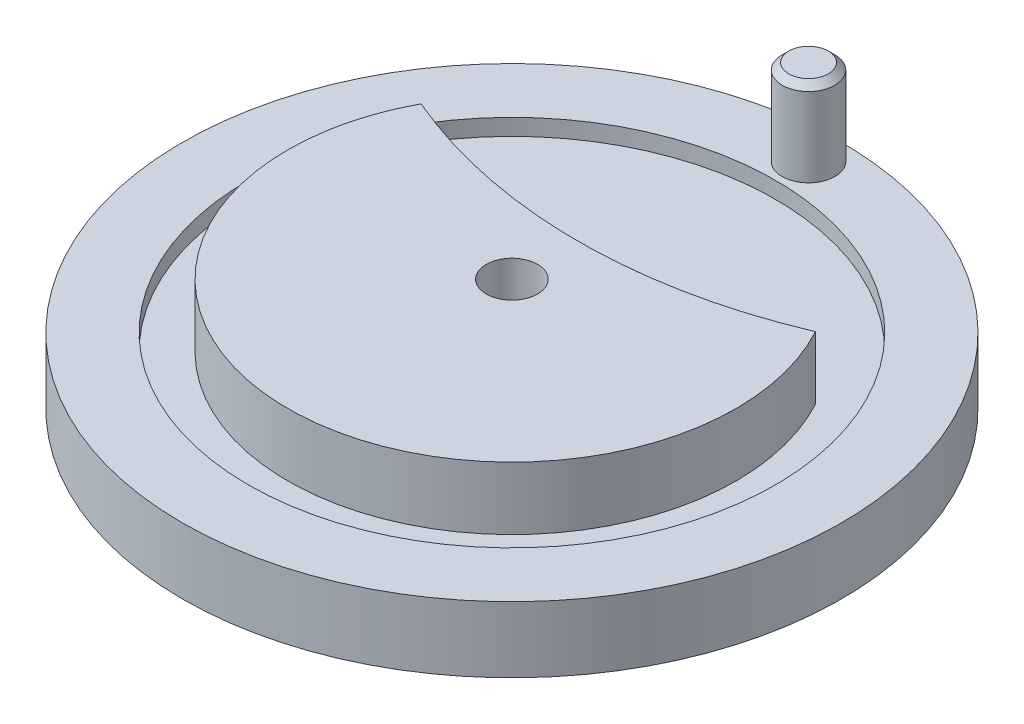
ISO-10303-21;
HEADER;
FILE_DESCRIPTION(('STEP AP214'),'2;1');
FILE_NAME('part.step','',(''),(''),'','','');
FILE_SCHEMA(('AUTOMOTIVE_DESIGN { 1 0 10303 214 1 1 1 1 }'));
ENDSEC;
DATA;
#1=APPLICATION_CONTEXT('core data for automotive mechanical design processes');
#2=APPLICATION_PROTOCOL_DEFINITION('international standard','automotive_design',2000,#1);
#3=PRODUCT_CONTEXT('',#1,'mechanical');
#4=PRODUCT('Part','Part','',(#3));
#5=PRODUCT_RELATED_PRODUCT_CATEGORY('part','',(#4));
#6=PRODUCT_DEFINITION_FORMATION('','',#4);
#7=PRODUCT_DEFINITION_CONTEXT('part definition',#1,'design');
#8=PRODUCT_DEFINITION('design','',#6,#7);
#9=PRODUCT_DEFINITION_SHAPE('','',#8);
#10=(LENGTH_UNIT() NAMED_UNIT(*) SI_UNIT(.MILLI.,.METRE.));
#11=(NAMED_UNIT(*) PLANE_ANGLE_UNIT() SI_UNIT($,.RADIAN.));
#12=(NAMED_UNIT(*) SI_UNIT($,.STERADIAN.) SOLID_ANGLE_UNIT());
#13=UNCERTAINTY_MEASURE_WITH_UNIT(LENGTH_MEASURE(1.E-05),#10,'distance_accuracy_value','');
#14=(GEOMETRIC_REPRESENTATION_CONTEXT(3) GLOBAL_UNCERTAINTY_ASSIGNED_CONTEXT((#13)) GLOBAL_UNIT_ASSIGNED_CONTEXT((#10,
#11,#12)) REPRESENTATION_CONTEXT('',''));
#15=CARTESIAN_POINT('',(0.,0.,0.));
#16=DIRECTION('',(0.,0.,1.));
#17=DIRECTION('',(1.,0.,0.));
#18=AXIS2_PLACEMENT_3D('',#15,#16,#17);
#19=CARTESIAN_POINT('',(0.,6.35,0.));
#20=DIRECTION('',(0.,-1.,0.));
#21=DIRECTION('',(0.,0.,-1.));
#22=AXIS2_PLACEMENT_3D('',#19,#20,#21);
#23=CYLINDRICAL_SURFACE('',#22,2.47650000000001);
#24=CARTESIAN_POINT('',(0.,10.8077,0.));
#25=DIRECTION('',(0.,1.,0.));
#26=DIRECTION('',(0.,0.,1.));
#27=AXIS2_PLACEMENT_3D('',#24,#25,#26);
#28=CIRCLE('',#27,2.47650000000001);
#29=CARTESIAN_POINT('',(0.,10.8077,2.47650000000001));
#30=VERTEX_POINT('',#29);
#31=EDGE_CURVE('E102',#30,#30,#28,.T.);
#32=ORIENTED_EDGE('',*,*,#31,.T.);
#33=EDGE_LOOP('',(#32));
#34=FACE_BOUND('',#33,.T.);
#35=CARTESIAN_POINT('',(0.,3.302,0.));
#36=DIRECTION('',(0.,-1.,0.));
#37=DIRECTION('',(0.,0.,-1.));
#38=AXIS2_PLACEMENT_3D('',#35,#36,#37);
#39=CIRCLE('',#38,2.47650000000001);
#40=CARTESIAN_POINT('',(0.,3.302,-2.47650000000001));
#41=VERTEX_POINT('',#40);
#42=EDGE_CURVE('E64',#41,#41,#39,.T.);
#43=ORIENTED_EDGE('',*,*,#42,.T.);
#44=EDGE_LOOP('',(#43));
#45=FACE_BOUND('',#44,.T.);
#46=ADVANCED_FACE('F59',(#34,#45),#23,.F.);
#47=CARTESIAN_POINT('',(0.,4.7625,0.));
#48=DIRECTION('',(0.,1.,0.));
#49=DIRECTION('',(0.,0.,1.));
#50=AXIS2_PLACEMENT_3D('',#47,#48,#49);
#51=PLANE('',#50);
#52=CARTESIAN_POINT('',(0.,4.7625,0.));
#53=DIRECTION('',(0.,1.,0.));
#54=DIRECTION('',(0.,0.,1.));
#55=AXIS2_PLACEMENT_3D('',#52,#53,#54);
#56=CIRCLE('',#55,25.4);
#57=CARTESIAN_POINT('',(0.,4.7625,25.4));
#58=VERTEX_POINT('',#57);
#59=EDGE_CURVE('E112',#58,#58,#56,.T.);
#60=ORIENTED_EDGE('',*,*,#59,.T.);
#61=EDGE_LOOP('',(#60));
#62=FACE_BOUND('',#61,.T.);
#63=CARTESIAN_POINT('',(0.,4.7625,0.));
#64=DIRECTION('',(0.,1.,0.));
#65=DIRECTION('',(0.,0.,1.));
#66=AXIS2_PLACEMENT_3D('',#63,#64,#65);
#67=CIRCLE('',#66,21.59);
#68=CARTESIAN_POINT('',(-19.0024788568272,4.7625,-10.2486046511628));
#69=VERTEX_POINT('',#68);
#70=CARTESIAN_POINT('',(19.0024788568272,4.7625,-10.2486046511628));
#71=VERTEX_POINT('',#70);
#72=EDGE_CURVE('E91',#69,#71,#67,.T.);
#73=ORIENTED_EDGE('',*,*,#72,.F.);
#74=CARTESIAN_POINT('',(0.,4.7625,-54.61));
#75=DIRECTION('',(0.,-1.,0.));
#76=DIRECTION('',(0.,0.,1.));
#77=AXIS2_PLACEMENT_3D('',#74,#75,#76);
#78=CIRCLE('',#77,48.26);
#79=EDGE_CURVE('E76',#71,#69,#78,.T.);
#80=ORIENTED_EDGE('',*,*,#79,.F.);
#81=EDGE_LOOP('',(#73,#80));
#82=FACE_BOUND('',#81,.T.);
#83=ADVANCED_FACE('F101',(#62,#82),#51,.T.);
#84=CARTESIAN_POINT('',(0.,6.35,0.));
#85=DIRECTION('',(0.,1.,0.));
#86=DIRECTION('',(0.,0.,1.));
#87=AXIS2_PLACEMENT_3D('',#84,#85,#86);
#88=PLANE('',#87);
#89=CARTESIAN_POINT('',(0.,6.35,-28.575));
#90=DIRECTION('',(0.,1.,0.));
#91=DIRECTION('',(0.,0.,1.));
#92=AXIS2_PLACEMENT_3D('',#89,#90,#91);
#93=CIRCLE('',#92,2.54);
#94=CARTESIAN_POINT('',(0.,6.35,-26.035));
#95=VERTEX_POINT('',#94);
#96=EDGE_CURVE('E105',#95,#95,#93,.T.);
#97=ORIENTED_EDGE('',*,*,#96,.F.);
#98=EDGE_LOOP('',(#97));
#99=FACE_BOUND('',#98,.T.);
#100=CARTESIAN_POINT('',(0.,6.35,0.));
#101=DIRECTION('',(0.,1.,0.));
#102=DIRECTION('',(0.,0.,1.));
#103=AXIS2_PLACEMENT_3D('',#100,#101,#102);
#104=CIRCLE('',#103,25.4);
#105=CARTESIAN_POINT('',(0.,6.35,25.4));
#106=VERTEX_POINT('',#105);
#107=EDGE_CURVE('E111',#106,#106,#104,.T.);
#108=ORIENTED_EDGE('',*,*,#107,.F.);
#109=EDGE_LOOP('',(#108));
#110=FACE_BOUND('',#109,.T.);
#111=CARTESIAN_POINT('',(0.,6.35,0.));
#112=DIRECTION('',(0.,1.,0.));
#113=DIRECTION('',(0.,0.,1.));
#114=AXIS2_PLACEMENT_3D('',#111,#112,#113);
#115=CIRCLE('',#114,31.75);
#116=CARTESIAN_POINT('',(0.,6.35,31.75));
#117=VERTEX_POINT('',#116);
#118=EDGE_CURVE('E118',#117,#117,#115,.T.);
#119=ORIENTED_EDGE('',*,*,#118,.T.);
#120=EDGE_LOOP('',(#119));
#121=FACE_BOUND('',#120,.T.);
#122=ADVANCED_FACE('F153',(#99,#110,#121),#88,.T.);
#123=CARTESIAN_POINT('',(0.,0.,0.));
#124=DIRECTION('',(0.,1.,0.));
#125=DIRECTION('',(0.,0.,1.));
#126=AXIS2_PLACEMENT_3D('',#123,#124,#125);
#127=PLANE('',#126);
#128=CARTESIAN_POINT('',(0.,0.,0.));
#129=DIRECTION('',(0.,1.,0.));
#130=DIRECTION('',(0.,0.,1.));
#131=AXIS2_PLACEMENT_3D('',#128,#129,#130);
#132=CIRCLE('',#131,6.35);
#133=CARTESIAN_POINT('',(0.,0.,6.35));
#134=VERTEX_POINT('',#133);
#135=EDGE_CURVE('E13',#134,#134,#132,.F.);
#136=ORIENTED_EDGE('',*,*,#135,.F.);
#137=EDGE_LOOP('',(#136));
#138=FACE_BOUND('',#137,.T.);
#139=CARTESIAN_POINT('',(0.,0.,0.));
#140=DIRECTION('',(0.,1.,0.));
#141=DIRECTION('',(0.,0.,1.));
#142=AXIS2_PLACEMENT_3D('',#139,#140,#141);
#143=CIRCLE('',#142,31.75);
#144=CARTESIAN_POINT('',(0.,0.,31.75));
#145=VERTEX_POINT('',#144);
#146=EDGE_CURVE('E115',#145,#145,#143,.T.);
#147=ORIENTED_EDGE('',*,*,#146,.F.);
#148=EDGE_LOOP('',(#147));
#149=FACE_BOUND('',#148,.T.);
#150=ADVANCED_FACE('F162',(#138,#149),#127,.F.);
#151=CARTESIAN_POINT('',(0.,6.35,0.));
#152=DIRECTION('',(0.,-1.,0.));
#153=DIRECTION('',(0.,0.,-1.));
#154=AXIS2_PLACEMENT_3D('',#151,#152,#153);
#155=CYLINDRICAL_SURFACE('',#154,31.75);
#156=ORIENTED_EDGE('',*,*,#118,.F.);
#157=EDGE_LOOP('',(#156));
#158=FACE_BOUND('',#157,.T.);
#159=ORIENTED_EDGE('',*,*,#146,.T.);
#160=EDGE_LOOP('',(#159));
#161=FACE_BOUND('',#160,.T.);
#162=ADVANCED_FACE('F165',(#158,#161),#155,.T.);
#163=CARTESIAN_POINT('',(0.,4.7625,0.));
#164=DIRECTION('',(0.,1.,0.));
#165=DIRECTION('',(0.,0.,1.));
#166=AXIS2_PLACEMENT_3D('',#163,#164,#165);
#167=CYLINDRICAL_SURFACE('',#166,25.4);
#168=ORIENTED_EDGE('',*,*,#59,.F.);
#169=EDGE_LOOP('',(#168));
#170=FACE_BOUND('',#169,.T.);
#171=ORIENTED_EDGE('',*,*,#107,.T.);
#172=EDGE_LOOP('',(#171));
#173=FACE_BOUND('',#172,.T.);
#174=ADVANCED_FACE('F159',(#170,#173),#167,.F.);
#175=CARTESIAN_POINT('',(0.,10.8077,-27.305));
#176=DIRECTION('',(0.,1.,0.));
#177=DIRECTION('',(0.,0.,1.));
#178=AXIS2_PLACEMENT_3D('',#175,#176,#177);
#179=PLANE('',#178);
#180=CARTESIAN_POINT('',(0.,10.8077,-54.61));
#181=DIRECTION('',(0.,-1.,0.));
#182=DIRECTION('',(0.,0.,1.));
#183=AXIS2_PLACEMENT_3D('',#180,#181,#182);
#184=CIRCLE('',#183,48.26);
#185=CARTESIAN_POINT('',(19.0024788568272,10.8077,-10.2486046511628));
#186=VERTEX_POINT('',#185);
#187=CARTESIAN_POINT('',(-19.0024788568272,10.8077,-10.2486046511628));
#188=VERTEX_POINT('',#187);
#189=EDGE_CURVE('E97',#186,#188,#184,.T.);
#190=ORIENTED_EDGE('',*,*,#189,.T.);
#191=CARTESIAN_POINT('',(0.,10.8077,0.));
#192=DIRECTION('',(0.,1.,0.));
#193=DIRECTION('',(0.,0.,1.));
#194=AXIS2_PLACEMENT_3D('',#191,#192,#193);
#195=CIRCLE('',#194,21.59);
#196=EDGE_CURVE('E84',#188,#186,#195,.T.);
#197=ORIENTED_EDGE('',*,*,#196,.T.);
#198=EDGE_LOOP('',(#190,#197));
#199=FACE_BOUND('',#198,.T.);
#200=ORIENTED_EDGE('',*,*,#31,.F.);
#201=EDGE_LOOP('',(#200));
#202=FACE_BOUND('',#201,.T.);
#203=ADVANCED_FACE('F172',(#199,#202),#179,.T.);
#204=CARTESIAN_POINT('',(0.,10.8077,-54.61));
#205=DIRECTION('',(0.,-1.,0.));
#206=DIRECTION('',(0.,0.,-1.));
#207=AXIS2_PLACEMENT_3D('',#204,#205,#206);
#208=CYLINDRICAL_SURFACE('',#207,48.26);
#209=ORIENTED_EDGE('',*,*,#79,.T.);
#210=DIRECTION('',(0.,-1.,0.));
#211=VECTOR('',#210,1.);
#212=CARTESIAN_POINT('',(-19.0024788568272,10.8077,-10.2486046511628));
#213=LINE('',#212,#211);
#214=EDGE_CURVE('E95',#188,#69,#213,.T.);
#215=ORIENTED_EDGE('',*,*,#214,.F.);
#216=ORIENTED_EDGE('',*,*,#189,.F.);
#217=DIRECTION('',(0.,-1.,0.));
#218=VECTOR('',#217,1.);
#219=CARTESIAN_POINT('',(19.0024788568272,10.8077,-10.2486046511628));
#220=LINE('',#219,#218);
#221=EDGE_CURVE('E93',#186,#71,#220,.T.);
#222=ORIENTED_EDGE('',*,*,#221,.T.);
#223=EDGE_LOOP('',(#209,#215,#216,#222));
#224=FACE_BOUND('',#223,.T.);
#225=ADVANCED_FACE('F99',(#224),#208,.F.);
#226=CARTESIAN_POINT('',(0.,10.8077,0.));
#227=DIRECTION('',(0.,-1.,0.));
#228=DIRECTION('',(0.,0.,-1.));
#229=AXIS2_PLACEMENT_3D('',#226,#227,#228);
#230=CYLINDRICAL_SURFACE('',#229,21.59);
#231=ORIENTED_EDGE('',*,*,#72,.T.);
#232=ORIENTED_EDGE('',*,*,#221,.F.);
#233=ORIENTED_EDGE('',*,*,#196,.F.);
#234=ORIENTED_EDGE('',*,*,#214,.T.);
#235=EDGE_LOOP('',(#231,#232,#233,#234));
#236=FACE_BOUND('',#235,.T.);
#237=ADVANCED_FACE('F92',(#236),#230,.T.);
#238=CARTESIAN_POINT('',(0.,14.605,-28.575));
#239=DIRECTION('',(0.,-1.,0.));
#240=DIRECTION('',(0.,0.,-1.));
#241=AXIS2_PLACEMENT_3D('',#238,#239,#240);
#242=CYLINDRICAL_SURFACE('',#241,2.54);
#243=CARTESIAN_POINT('',(0.,13.97,-28.575));
#244=DIRECTION('',(0.,1.,0.));
#245=DIRECTION('',(0.,0.,1.));
#246=AXIS2_PLACEMENT_3D('',#243,#244,#245);
#247=CIRCLE('',#246,2.54);
#248=CARTESIAN_POINT('',(0.,13.97,-26.035));
#249=VERTEX_POINT('',#248);
#250=EDGE_CURVE('E69',#249,#249,#247,.F.);
#251=ORIENTED_EDGE('',*,*,#250,.T.);
#252=EDGE_LOOP('',(#251));
#253=FACE_BOUND('',#252,.T.);
#254=ORIENTED_EDGE('',*,*,#96,.T.);
#255=EDGE_LOOP('',(#254));
#256=FACE_BOUND('',#255,.T.);
#257=ADVANCED_FACE('F129',(#253,#256),#242,.T.);
#258=CARTESIAN_POINT('',(0.,14.605,-28.575));
#259=DIRECTION('',(0.,1.,0.));
#260=DIRECTION('',(0.,0.,1.));
#261=AXIS2_PLACEMENT_3D('',#258,#259,#260);
#262=PLANE('',#261);
#263=CARTESIAN_POINT('',(0.,14.605,-28.575));
#264=DIRECTION('',(0.,1.,0.));
#265=DIRECTION('',(0.,0.,1.));
#266=AXIS2_PLACEMENT_3D('',#263,#264,#265);
#267=CIRCLE('',#266,1.90499999999999);
#268=CARTESIAN_POINT('',(0.,14.605,-26.67));
#269=VERTEX_POINT('',#268);
#270=EDGE_CURVE('E121',#269,#269,#267,.T.);
#271=ORIENTED_EDGE('',*,*,#270,.T.);
#272=EDGE_LOOP('',(#271));
#273=FACE_BOUND('',#272,.T.);
#274=ADVANCED_FACE('F135',(#273),#262,.T.);
#275=CARTESIAN_POINT('',(0.,14.605,-28.575));
#276=DIRECTION('',(0.,-1.,0.));
#277=DIRECTION('',(0.,0.,-1.));
#278=AXIS2_PLACEMENT_3D('',#275,#276,#277);
#279=CONICAL_SURFACE('',#278,1.90499999999999,0.785398163397454);
#280=ORIENTED_EDGE('',*,*,#250,.F.);
#281=EDGE_LOOP('',(#280));
#282=FACE_BOUND('',#281,.T.);
#283=ORIENTED_EDGE('',*,*,#270,.F.);
#284=EDGE_LOOP('',(#283));
#285=FACE_BOUND('',#284,.T.);
#286=ADVANCED_FACE('F62',(#282,#285),#279,.T.);
#287=CARTESIAN_POINT('',(0.,-3.302,0.));
#288=DIRECTION('',(0.,-1.,0.));
#289=DIRECTION('',(0.,0.,-1.));
#290=AXIS2_PLACEMENT_3D('',#287,#288,#289);
#291=PLANE('',#290);
#292=CARTESIAN_POINT('',(0.,-3.302,0.));
#293=DIRECTION('',(0.,-1.,0.));
#294=DIRECTION('',(0.,0.,-1.));
#295=AXIS2_PLACEMENT_3D('',#292,#293,#294);
#296=CIRCLE('',#295,4.445);
#297=CARTESIAN_POINT('',(0.,-3.302,-4.445));
#298=VERTEX_POINT('',#297);
#299=EDGE_CURVE('E272',#298,#298,#296,.T.);
#300=ORIENTED_EDGE('',*,*,#299,.F.);
#301=EDGE_LOOP('',(#300));
#302=FACE_BOUND('',#301,.T.);
#303=CARTESIAN_POINT('',(0.,-3.302,0.));
#304=DIRECTION('',(0.,-1.,0.));
#305=DIRECTION('',(0.,0.,-1.));
#306=AXIS2_PLACEMENT_3D('',#303,#304,#305);
#307=CIRCLE('',#306,6.35);
#308=CARTESIAN_POINT('',(0.,-3.302,6.35));
#309=VERTEX_POINT('',#308);
#310=EDGE_CURVE('E274',#309,#309,#307,.T.);
#311=ORIENTED_EDGE('',*,*,#310,.T.);
#312=EDGE_LOOP('',(#311));
#313=FACE_BOUND('',#312,.T.);
#314=ADVANCED_FACE('F134',(#302,#313),#291,.T.);
#315=CARTESIAN_POINT('',(0.,-3.302,0.));
#316=DIRECTION('',(0.,1.,0.));
#317=DIRECTION('',(0.,0.,1.));
#318=AXIS2_PLACEMENT_3D('',#315,#316,#317);
#319=CYLINDRICAL_SURFACE('',#318,6.35);
#320=CARTESIAN_POINT('',(0.,-3.302,6.35));
#321=CARTESIAN_POINT('',(0.,-3.26760416666667,6.35));
#322=CARTESIAN_POINT('',(0.,-3.23320833333333,6.35));
#323=CARTESIAN_POINT('',(0.,-3.16441666666667,6.35));
#324=CARTESIAN_POINT('',(0.,-3.13002083333333,6.35));
#325=CARTESIAN_POINT('',(0.,-3.06122916666667,6.35));
#326=CARTESIAN_POINT('',(0.,-3.02683333333333,6.35));
#327=CARTESIAN_POINT('',(0.,-2.95804166666667,6.35));
#328=CARTESIAN_POINT('',(0.,-2.92364583333333,6.35));
#329=CARTESIAN_POINT('',(0.,-2.85485416666667,6.35));
#330=CARTESIAN_POINT('',(0.,-2.82045833333333,6.35));
#331=CARTESIAN_POINT('',(0.,-2.75166666666667,6.35));
#332=CARTESIAN_POINT('',(0.,-2.71727083333333,6.35));
#333=CARTESIAN_POINT('',(0.,-2.64847916666667,6.35));
#334=CARTESIAN_POINT('',(0.,-2.61408333333333,6.35));
#335=CARTESIAN_POINT('',(0.,-2.54529166666667,6.35));
#336=CARTESIAN_POINT('',(0.,-2.51089583333333,6.35));
#337=CARTESIAN_POINT('',(0.,-2.44210416666667,6.35));
#338=CARTESIAN_POINT('',(0.,-2.40770833333333,6.35));
#339=CARTESIAN_POINT('',(0.,-2.33891666666667,6.35));
#340=CARTESIAN_POINT('',(0.,-2.30452083333333,6.35));
#341=CARTESIAN_POINT('',(0.,-2.23572916666667,6.35));
#342=CARTESIAN_POINT('',(0.,-2.20133333333333,6.35));
#343=CARTESIAN_POINT('',(0.,-2.13254166666667,6.35));
#344=CARTESIAN_POINT('',(0.,-2.09814583333333,6.35));
#345=CARTESIAN_POINT('',(0.,-2.02935416666667,6.35));
#346=CARTESIAN_POINT('',(0.,-1.99495833333333,6.35));
#347=CARTESIAN_POINT('',(0.,-1.92616666666667,6.35));
#348=CARTESIAN_POINT('',(0.,-1.89177083333333,6.35));
#349=CARTESIAN_POINT('',(0.,-1.82297916666667,6.35));
#350=CARTESIAN_POINT('',(0.,-1.78858333333333,6.35));
#351=CARTESIAN_POINT('',(0.,-1.71979166666667,6.35));
#352=CARTESIAN_POINT('',(0.,-1.68539583333333,6.35));
#353=CARTESIAN_POINT('',(0.,-1.61660416666667,6.35));
#354=CARTESIAN_POINT('',(0.,-1.58220833333333,6.35));
#355=CARTESIAN_POINT('',(0.,-1.51341666666667,6.35));
#356=CARTESIAN_POINT('',(0.,-1.47902083333333,6.35));
#357=CARTESIAN_POINT('',(0.,-1.41022916666667,6.35));
#358=CARTESIAN_POINT('',(0.,-1.37583333333333,6.35));
#359=CARTESIAN_POINT('',(0.,-1.30704166666667,6.35));
#360=CARTESIAN_POINT('',(0.,-1.27264583333333,6.35));
#361=CARTESIAN_POINT('',(0.,-1.20385416666667,6.35));
#362=CARTESIAN_POINT('',(0.,-1.16945833333333,6.35));
#363=CARTESIAN_POINT('',(0.,-1.10066666666667,6.35));
#364=CARTESIAN_POINT('',(0.,-1.06627083333333,6.35));
#365=CARTESIAN_POINT('',(0.,-0.997479166666666,6.35));
#366=CARTESIAN_POINT('',(0.,-0.963083333333333,6.35));
#367=CARTESIAN_POINT('',(0.,-0.894291666666666,6.35));
#368=CARTESIAN_POINT('',(0.,-0.859895833333333,6.35));
#369=CARTESIAN_POINT('',(0.,-0.791104166666666,6.35));
#370=CARTESIAN_POINT('',(0.,-0.756708333333333,6.35));
#371=CARTESIAN_POINT('',(0.,-0.687916666666667,6.35));
#372=CARTESIAN_POINT('',(0.,-0.653520833333333,6.35));
#373=CARTESIAN_POINT('',(0.,-0.584729166666667,6.35));
#374=CARTESIAN_POINT('',(0.,-0.550333333333333,6.35));
#375=CARTESIAN_POINT('',(0.,-0.481541666666667,6.35));
#376=CARTESIAN_POINT('',(0.,-0.447145833333333,6.35));
#377=CARTESIAN_POINT('',(0.,-0.378354166666667,6.35));
#378=CARTESIAN_POINT('',(0.,-0.343958333333333,6.35));
#379=CARTESIAN_POINT('',(0.,-0.275166666666667,6.35));
#380=CARTESIAN_POINT('',(0.,-0.240770833333333,6.35));
#381=CARTESIAN_POINT('',(0.,-0.171979166666667,6.35));
#382=CARTESIAN_POINT('',(0.,-0.137583333333333,6.35));
#383=CARTESIAN_POINT('',(0.,-0.0687916666666666,6.35));
#384=CARTESIAN_POINT('',(0.,-0.0343958333333333,6.35));
#385=CARTESIAN_POINT('',(0.,0.,6.35));
#386=B_SPLINE_CURVE_WITH_KNOTS('',3,(#320,#321,#322,#323,#324,#325,#326,#327,#328,#329,#330,
#331,#332,#333,#334,#335,#336,#337,#338,#339,#340,#341,#342,#343,#344,#345,#346,#347,#348,#349,
#350,#351,#352,#353,#354,#355,#356,#357,#358,#359,#360,#361,#362,#363,#364,#365,#366,#367,#368,
#369,#370,#371,#372,#373,#374,#375,#376,#377,#378,#379,#380,#381,#382,#383,#384,#385),
.UNSPECIFIED.,.F.,.F.,(4,2,2,2,2,2,2,2,2,2,2,2,2,2,2,2,2,2,2,2,2,2,2,2,2,2,2,2,2,2,2,2,4),(0.,
0.1031875,0.206375,0.3095625,0.41275,0.5159375,0.619125,0.7223125,0.8255,0.9286875,1.031875,
1.1350625,1.23825,1.3414375,1.444625,1.5478125,1.651,1.7541875,1.857375,1.9605625,2.06375,
2.1669375,2.270125,2.3733125,2.4765,2.5796875,2.682875,2.7860625,2.88925,2.9924375,3.095625,
3.1988125,3.302),.UNSPECIFIED.);
#387=EDGE_CURVE('BSEAM228',#309,#134,#386,.T.);
#388=ORIENTED_EDGE('',*,*,#310,.F.);
#389=ORIENTED_EDGE('',*,*,#135,.T.);
#390=ORIENTED_EDGE('',*,*,#387,.T.);
#391=ORIENTED_EDGE('',*,*,#387,.F.);
#392=EDGE_LOOP('',(#388,#390,#389,#391));
#393=FACE_BOUND('',#392,.T.);
#394=ADVANCED_FACE('F228',(#393),#319,.T.);
#395=CARTESIAN_POINT('',(0.,3.302,0.));
#396=DIRECTION('',(0.,-1.,0.));
#397=DIRECTION('',(0.,0.,-1.));
#398=AXIS2_PLACEMENT_3D('',#395,#396,#397);
#399=CYLINDRICAL_SURFACE('',#398,4.445);
#400=CARTESIAN_POINT('',(0.,3.302,0.));
#401=DIRECTION('',(0.,-1.,0.));
#402=DIRECTION('',(0.,0.,-1.));
#403=AXIS2_PLACEMENT_3D('',#400,#401,#402);
#404=CIRCLE('',#403,4.445);
#405=CARTESIAN_POINT('',(0.,3.302,-4.445));
#406=VERTEX_POINT('',#405);
#407=EDGE_CURVE('E271',#406,#406,#404,.T.);
#408=CARTESIAN_POINT('',(0.,3.302,-4.445));
#409=CARTESIAN_POINT('',(0.,3.23320833333333,-4.445));
#410=CARTESIAN_POINT('',(0.,3.16441666666667,-4.445));
#411=CARTESIAN_POINT('',(0.,3.02683333333333,-4.445));
#412=CARTESIAN_POINT('',(0.,2.95804166666667,-4.445));
#413=CARTESIAN_POINT('',(0.,2.82045833333333,-4.445));
#414=CARTESIAN_POINT('',(0.,2.75166666666667,-4.445));
#415=CARTESIAN_POINT('',(0.,2.61408333333333,-4.445));
#416=CARTESIAN_POINT('',(0.,2.54529166666667,-4.445));
#417=CARTESIAN_POINT('',(0.,2.40770833333333,-4.445));
#418=CARTESIAN_POINT('',(0.,2.33891666666667,-4.445));
#419=CARTESIAN_POINT('',(0.,2.20133333333333,-4.445));
#420=CARTESIAN_POINT('',(0.,2.13254166666667,-4.445));
#421=CARTESIAN_POINT('',(0.,1.99495833333333,-4.445));
#422=CARTESIAN_POINT('',(0.,1.92616666666667,-4.445));
#423=CARTESIAN_POINT('',(0.,1.78858333333333,-4.445));
#424=CARTESIAN_POINT('',(0.,1.71979166666667,-4.445));
#425=CARTESIAN_POINT('',(0.,1.58220833333333,-4.445));
#426=CARTESIAN_POINT('',(0.,1.51341666666667,-4.445));
#427=CARTESIAN_POINT('',(0.,1.37583333333333,-4.445));
#428=CARTESIAN_POINT('',(0.,1.30704166666667,-4.445));
#429=CARTESIAN_POINT('',(0.,1.16945833333333,-4.445));
#430=CARTESIAN_POINT('',(0.,1.10066666666667,-4.445));
#431=CARTESIAN_POINT('',(0.,0.963083333333334,-4.445));
#432=CARTESIAN_POINT('',(0.,0.894291666666667,-4.445));
#433=CARTESIAN_POINT('',(0.,0.756708333333334,-4.445));
#434=CARTESIAN_POINT('',(0.,0.687916666666667,-4.445));
#435=CARTESIAN_POINT('',(0.,0.550333333333334,-4.445));
#436=CARTESIAN_POINT('',(0.,0.481541666666667,-4.445));
#437=CARTESIAN_POINT('',(0.,0.343958333333334,-4.445));
#438=CARTESIAN_POINT('',(0.,0.275166666666667,-4.445));
#439=CARTESIAN_POINT('',(0.,0.137583333333334,-4.445));
#440=CARTESIAN_POINT('',(0.,0.0687916666666671,-4.445));
#441=CARTESIAN_POINT('',(0.,-0.0687916666666662,-4.445));
#442=CARTESIAN_POINT('',(0.,-0.137583333333333,-4.445));
#443=CARTESIAN_POINT('',(0.,-0.275166666666666,-4.445));
#444=CARTESIAN_POINT('',(0.,-0.343958333333333,-4.445));
#445=CARTESIAN_POINT('',(0.,-0.481541666666666,-4.445));
#446=CARTESIAN_POINT('',(0.,-0.550333333333333,-4.445));
#447=CARTESIAN_POINT('',(0.,-0.687916666666666,-4.445));
#448=CARTESIAN_POINT('',(0.,-0.756708333333333,-4.445));
#449=CARTESIAN_POINT('',(0.,-0.894291666666666,-4.445));
#450=CARTESIAN_POINT('',(0.,-0.963083333333333,-4.445));
#451=CARTESIAN_POINT('',(0.,-1.10066666666667,-4.445));
#452=CARTESIAN_POINT('',(0.,-1.16945833333333,-4.445));
#453=CARTESIAN_POINT('',(0.,-1.30704166666667,-4.445));
#454=CARTESIAN_POINT('',(0.,-1.37583333333333,-4.445));
#455=CARTESIAN_POINT('',(0.,-1.51341666666667,-4.445));
#456=CARTESIAN_POINT('',(0.,-1.58220833333333,-4.445));
#457=CARTESIAN_POINT('',(0.,-1.71979166666667,-4.445));
#458=CARTESIAN_POINT('',(0.,-1.78858333333333,-4.445));
#459=CARTESIAN_POINT('',(0.,-1.92616666666667,-4.445));
#460=CARTESIAN_POINT('',(0.,-1.99495833333333,-4.445));
#461=CARTESIAN_POINT('',(0.,-2.13254166666667,-4.445));
#462=CARTESIAN_POINT('',(0.,-2.20133333333333,-4.445));
#463=CARTESIAN_POINT('',(0.,-2.33891666666667,-4.445));
#464=CARTESIAN_POINT('',(0.,-2.40770833333333,-4.445));
#465=CARTESIAN_POINT('',(0.,-2.54529166666667,-4.445));
#466=CARTESIAN_POINT('',(0.,-2.61408333333333,-4.445));
#467=CARTESIAN_POINT('',(0.,-2.75166666666667,-4.445));
#468=CARTESIAN_POINT('',(0.,-2.82045833333333,-4.445));
#469=CARTESIAN_POINT('',(0.,-2.95804166666667,-4.445));
#470=CARTESIAN_POINT('',(0.,-3.02683333333333,-4.445));
#471=CARTESIAN_POINT('',(0.,-3.16441666666667,-4.445));
#472=CARTESIAN_POINT('',(0.,-3.23320833333333,-4.445));
#473=CARTESIAN_POINT('',(0.,-3.302,-4.445));
#474=B_SPLINE_CURVE_WITH_KNOTS('',3,(#408,#409,#410,#411,#412,#413,#414,#415,#416,#417,#418,
#419,#420,#421,#422,#423,#424,#425,#426,#427,#428,#429,#430,#431,#432,#433,#434,#435,#436,#437,
#438,#439,#440,#441,#442,#443,#444,#445,#446,#447,#448,#449,#450,#451,#452,#453,#454,#455,#456,
#457,#458,#459,#460,#461,#462,#463,#464,#465,#466,#467,#468,#469,#470,#471,#472,#473),
.UNSPECIFIED.,.F.,.F.,(4,2,2,2,2,2,2,2,2,2,2,2,2,2,2,2,2,2,2,2,2,2,2,2,2,2,2,2,2,2,2,2,4),(0.,
0.206375,0.41275,0.619125,0.8255,1.031875,1.23825,1.444625,1.651,1.857375,2.06375,2.270125,
2.4765,2.682875,2.88925,3.095625,3.302,3.508375,3.71475,3.921125,4.1275,4.333875,4.54025,
4.746625,4.953,5.159375,5.36575,5.572125,5.7785,5.984875,6.19125,6.397625,6.604),.UNSPECIFIED.);
#475=EDGE_CURVE('BSEAM238',#406,#298,#474,.T.);
#476=ORIENTED_EDGE('',*,*,#407,.F.);
#477=ORIENTED_EDGE('',*,*,#299,.T.);
#478=ORIENTED_EDGE('',*,*,#475,.T.);
#479=ORIENTED_EDGE('',*,*,#475,.F.);
#480=EDGE_LOOP('',(#476,#478,#477,#479));
#481=FACE_BOUND('',#480,.T.);
#482=ADVANCED_FACE('F238',(#481),#399,.F.);
#483=CARTESIAN_POINT('',(0.,3.302,0.));
#484=DIRECTION('',(0.,-1.,0.));
#485=DIRECTION('',(0.,0.,-1.));
#486=AXIS2_PLACEMENT_3D('',#483,#484,#485);
#487=PLANE('',#486);
#488=ORIENTED_EDGE('',*,*,#42,.F.);
#489=EDGE_LOOP('',(#488));
#490=FACE_BOUND('',#489,.T.);
#491=ORIENTED_EDGE('',*,*,#407,.T.);
#492=EDGE_LOOP('',(#491));
#493=FACE_BOUND('',#492,.T.);
#494=ADVANCED_FACE('F253',(#490,#493),#487,.T.);
#495=CLOSED_SHELL('',(#46,#83,#122,#150,#162,#174,#203,#225,#237,#257,#274,#286,#314,#394,#482,#494));
#496=MANIFOLD_SOLID_BREP('B2',#495);
#497=ADVANCED_BREP_SHAPE_REPRESENTATION('',(#18,#496),#14);
#498=SHAPE_DEFINITION_REPRESENTATION(#9,#497);
ENDSEC;
END-ISO-10303-21;
